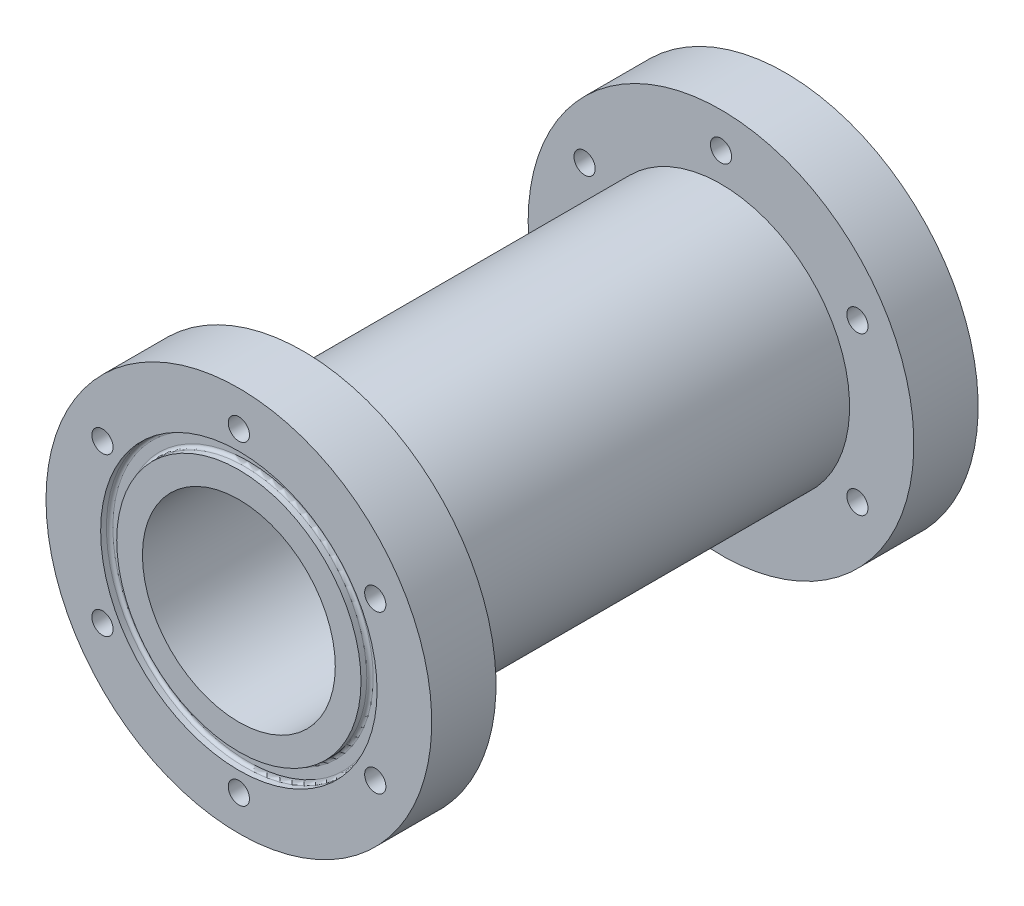
ISO-10303-21;
HEADER;
FILE_DESCRIPTION(('STEP AP214'),'2;1');
FILE_NAME('part.step','',(''),(''),'','','');
FILE_SCHEMA(('AUTOMOTIVE_DESIGN { 1 0 10303 214 1 1 1 1 }'));
ENDSEC;
DATA;
#1=APPLICATION_CONTEXT('core data for automotive mechanical design processes');
#2=APPLICATION_PROTOCOL_DEFINITION('international standard','automotive_design',2000,#1);
#3=PRODUCT_CONTEXT('',#1,'mechanical');
#4=PRODUCT('Part','Part','',(#3));
#5=PRODUCT_RELATED_PRODUCT_CATEGORY('part','',(#4));
#6=PRODUCT_DEFINITION_FORMATION('','',#4);
#7=PRODUCT_DEFINITION_CONTEXT('part definition',#1,'design');
#8=PRODUCT_DEFINITION('design','',#6,#7);
#9=PRODUCT_DEFINITION_SHAPE('','',#8);
#10=(LENGTH_UNIT() NAMED_UNIT(*) SI_UNIT(.MILLI.,.METRE.));
#11=(NAMED_UNIT(*) PLANE_ANGLE_UNIT() SI_UNIT($,.RADIAN.));
#12=(NAMED_UNIT(*) SI_UNIT($,.STERADIAN.) SOLID_ANGLE_UNIT());
#13=UNCERTAINTY_MEASURE_WITH_UNIT(LENGTH_MEASURE(1.E-05),#10,'distance_accuracy_value','');
#14=(GEOMETRIC_REPRESENTATION_CONTEXT(3) GLOBAL_UNCERTAINTY_ASSIGNED_CONTEXT((#13)) GLOBAL_UNIT_ASSIGNED_CONTEXT((#10,
#11,#12)) REPRESENTATION_CONTEXT('',''));
#15=CARTESIAN_POINT('',(0.,0.,0.));
#16=DIRECTION('',(0.,0.,1.));
#17=DIRECTION('',(1.,0.,0.));
#18=AXIS2_PLACEMENT_3D('',#15,#16,#17);
#19=CARTESIAN_POINT('',(0.,0.,42.5));
#20=DIRECTION('',(0.,0.,1.));
#21=DIRECTION('',(1.,0.,0.));
#22=AXIS2_PLACEMENT_3D('',#19,#20,#21);
#23=PLANE('',#22);
#24=CARTESIAN_POINT('',(0.,0.,42.5));
#25=DIRECTION('',(0.,0.,1.));
#26=DIRECTION('',(1.,0.,0.));
#27=AXIS2_PLACEMENT_3D('',#24,#25,#26);
#28=CIRCLE('',#27,15.);
#29=CARTESIAN_POINT('',(15.,0.,42.5));
#30=VERTEX_POINT('',#29);
#31=EDGE_CURVE('E79',#30,#30,#28,.T.);
#32=ORIENTED_EDGE('',*,*,#31,.F.);
#33=EDGE_LOOP('',(#32));
#34=FACE_BOUND('',#33,.T.);
#35=CARTESIAN_POINT('',(0.,0.,42.5));
#36=DIRECTION('',(0.,0.,-1.));
#37=DIRECTION('',(-1.,0.,0.));
#38=AXIS2_PLACEMENT_3D('',#35,#36,#37);
#39=CIRCLE('',#38,19.);
#40=CARTESIAN_POINT('',(-19.,0.,42.5));
#41=VERTEX_POINT('',#40);
#42=EDGE_CURVE('E178',#41,#41,#39,.T.);
#43=ORIENTED_EDGE('',*,*,#42,.F.);
#44=EDGE_LOOP('',(#43));
#45=FACE_BOUND('',#44,.T.);
#46=ADVANCED_FACE('F41',(#34,#45),#23,.T.);
#47=CARTESIAN_POINT('',(0.,0.,42.5));
#48=DIRECTION('',(0.,0.,-1.));
#49=DIRECTION('',(-1.,0.,0.));
#50=AXIS2_PLACEMENT_3D('',#47,#48,#49);
#51=CYLINDRICAL_SURFACE('',#50,20.);
#52=CARTESIAN_POINT('',(0.,0.,-32.5));
#53=DIRECTION('',(0.,0.,-1.));
#54=DIRECTION('',(-1.,0.,0.));
#55=AXIS2_PLACEMENT_3D('',#52,#53,#54);
#56=CIRCLE('',#55,20.);
#57=CARTESIAN_POINT('',(-20.,0.,-32.5));
#58=VERTEX_POINT('',#57);
#59=EDGE_CURVE('E76',#58,#58,#56,.T.);
#60=ORIENTED_EDGE('',*,*,#59,.F.);
#61=EDGE_LOOP('',(#60));
#62=FACE_BOUND('',#61,.T.);
#63=CARTESIAN_POINT('',(0.,0.,32.5));
#64=DIRECTION('',(0.,0.,1.));
#65=DIRECTION('',(1.,0.,0.));
#66=AXIS2_PLACEMENT_3D('',#63,#64,#65);
#67=CIRCLE('',#66,20.);
#68=CARTESIAN_POINT('',(20.,0.,32.5));
#69=VERTEX_POINT('',#68);
#70=EDGE_CURVE('E61',#69,#69,#67,.T.);
#71=ORIENTED_EDGE('',*,*,#70,.F.);
#72=EDGE_LOOP('',(#71));
#73=FACE_BOUND('',#72,.T.);
#74=ADVANCED_FACE('F185',(#62,#73),#51,.T.);
#75=CARTESIAN_POINT('',(0.,0.,-42.5));
#76=DIRECTION('',(0.,0.,1.));
#77=DIRECTION('',(1.,0.,0.));
#78=AXIS2_PLACEMENT_3D('',#75,#76,#77);
#79=PLANE('',#78);
#80=CARTESIAN_POINT('',(0.,0.,-42.5));
#81=DIRECTION('',(0.,0.,1.));
#82=DIRECTION('',(1.,0.,0.));
#83=AXIS2_PLACEMENT_3D('',#80,#81,#82);
#84=CIRCLE('',#83,15.);
#85=CARTESIAN_POINT('',(15.,0.,-42.5));
#86=VERTEX_POINT('',#85);
#87=EDGE_CURVE('E80',#86,#86,#84,.T.);
#88=ORIENTED_EDGE('',*,*,#87,.T.);
#89=EDGE_LOOP('',(#88));
#90=FACE_BOUND('',#89,.T.);
#91=CARTESIAN_POINT('',(0.,0.,-42.5));
#92=DIRECTION('',(0.,0.,-1.));
#93=DIRECTION('',(-1.,0.,0.));
#94=AXIS2_PLACEMENT_3D('',#91,#92,#93);
#95=CIRCLE('',#94,19.);
#96=CARTESIAN_POINT('',(-19.,0.,-42.5));
#97=VERTEX_POINT('',#96);
#98=EDGE_CURVE('E130',#97,#97,#95,.T.);
#99=ORIENTED_EDGE('',*,*,#98,.T.);
#100=EDGE_LOOP('',(#99));
#101=FACE_BOUND('',#100,.T.);
#102=ADVANCED_FACE('F192',(#90,#101),#79,.F.);
#103=CARTESIAN_POINT('',(0.,0.,-42.5));
#104=DIRECTION('',(0.,0.,-1.));
#105=DIRECTION('',(-1.,0.,0.));
#106=AXIS2_PLACEMENT_3D('',#103,#104,#105);
#107=CIRCLE('',#106,21.5);
#108=CARTESIAN_POINT('',(-21.5,0.,-42.5));
#109=VERTEX_POINT('',#108);
#110=EDGE_CURVE('E127',#109,#109,#107,.T.);
#111=ORIENTED_EDGE('',*,*,#110,.F.);
#112=EDGE_LOOP('',(#111));
#113=FACE_BOUND('',#112,.T.);
#114=CARTESIAN_POINT('',(-21.2176223927189,-12.2499999999998,-42.5));
#115=DIRECTION('',(0.,0.,-1.));
#116=DIRECTION('',(-1.,0.,0.));
#117=AXIS2_PLACEMENT_3D('',#114,#115,#116);
#118=CIRCLE('',#117,1.65);
#119=CARTESIAN_POINT('',(-22.8676223927189,-12.2499999999998,-42.5));
#120=VERTEX_POINT('',#119);
#121=EDGE_CURVE('E118',#120,#120,#118,.T.);
#122=ORIENTED_EDGE('',*,*,#121,.F.);
#123=EDGE_LOOP('',(#122));
#124=FACE_BOUND('',#123,.T.);
#125=CARTESIAN_POINT('',(0.,-24.5,-42.5));
#126=DIRECTION('',(0.,0.,-1.));
#127=DIRECTION('',(-1.,0.,0.));
#128=AXIS2_PLACEMENT_3D('',#125,#126,#127);
#129=CIRCLE('',#128,1.65);
#130=CARTESIAN_POINT('',(-1.65,-24.5,-42.5));
#131=VERTEX_POINT('',#130);
#132=EDGE_CURVE('E112',#131,#131,#129,.T.);
#133=ORIENTED_EDGE('',*,*,#132,.F.);
#134=EDGE_LOOP('',(#133));
#135=FACE_BOUND('',#134,.T.);
#136=CARTESIAN_POINT('',(21.2176223927187,-12.2500000000001,-42.5));
#137=DIRECTION('',(0.,0.,-1.));
#138=DIRECTION('',(-1.,0.,0.));
#139=AXIS2_PLACEMENT_3D('',#136,#137,#138);
#140=CIRCLE('',#139,1.65);
#141=CARTESIAN_POINT('',(19.5676223927187,-12.2500000000001,-42.5));
#142=VERTEX_POINT('',#141);
#143=EDGE_CURVE('E106',#142,#142,#140,.T.);
#144=ORIENTED_EDGE('',*,*,#143,.F.);
#145=EDGE_LOOP('',(#144));
#146=FACE_BOUND('',#145,.T.);
#147=CARTESIAN_POINT('',(21.2176223927188,12.25,-42.5));
#148=DIRECTION('',(0.,0.,-1.));
#149=DIRECTION('',(-1.,0.,0.));
#150=AXIS2_PLACEMENT_3D('',#147,#148,#149);
#151=CIRCLE('',#150,1.65);
#152=CARTESIAN_POINT('',(19.5676223927188,12.25,-42.5));
#153=VERTEX_POINT('',#152);
#154=EDGE_CURVE('E100',#153,#153,#151,.T.);
#155=ORIENTED_EDGE('',*,*,#154,.F.);
#156=EDGE_LOOP('',(#155));
#157=FACE_BOUND('',#156,.T.);
#158=CARTESIAN_POINT('',(0.,24.5,-42.5));
#159=DIRECTION('',(0.,0.,-1.));
#160=DIRECTION('',(-1.,0.,0.));
#161=AXIS2_PLACEMENT_3D('',#158,#159,#160);
#162=CIRCLE('',#161,1.65);
#163=CARTESIAN_POINT('',(-1.65,24.5,-42.5));
#164=VERTEX_POINT('',#163);
#165=EDGE_CURVE('E94',#164,#164,#162,.T.);
#166=ORIENTED_EDGE('',*,*,#165,.F.);
#167=EDGE_LOOP('',(#166));
#168=FACE_BOUND('',#167,.T.);
#169=CARTESIAN_POINT('',(0.,0.,-42.5));
#170=DIRECTION('',(0.,0.,-1.));
#171=DIRECTION('',(-1.,0.,0.));
#172=AXIS2_PLACEMENT_3D('',#169,#170,#171);
#173=CIRCLE('',#172,30.);
#174=CARTESIAN_POINT('',(-30.,0.,-42.5));
#175=VERTEX_POINT('',#174);
#176=EDGE_CURVE('E86',#175,#175,#173,.T.);
#177=ORIENTED_EDGE('',*,*,#176,.T.);
#178=EDGE_LOOP('',(#177));
#179=FACE_BOUND('',#178,.T.);
#180=CARTESIAN_POINT('',(-21.2176223927186,12.2500000000002,-42.5));
#181=DIRECTION('',(0.,0.,-1.));
#182=DIRECTION('',(-1.,0.,0.));
#183=AXIS2_PLACEMENT_3D('',#180,#181,#182);
#184=CIRCLE('',#183,1.65);
#185=CARTESIAN_POINT('',(-22.8676223927186,12.2500000000002,-42.5));
#186=VERTEX_POINT('',#185);
#187=EDGE_CURVE('E124',#186,#186,#184,.T.);
#188=ORIENTED_EDGE('',*,*,#187,.F.);
#189=EDGE_LOOP('',(#188));
#190=FACE_BOUND('',#189,.T.);
#191=ADVANCED_FACE('F200',(#113,#124,#135,#146,#157,#168,#179,#190),#79,.F.);
#192=CARTESIAN_POINT('',(0.,0.,42.5));
#193=DIRECTION('',(0.,0.,-1.));
#194=DIRECTION('',(-1.,0.,0.));
#195=AXIS2_PLACEMENT_3D('',#192,#193,#194);
#196=CIRCLE('',#195,21.5);
#197=CARTESIAN_POINT('',(-21.5,0.,42.5));
#198=VERTEX_POINT('',#197);
#199=EDGE_CURVE('E175',#198,#198,#196,.T.);
#200=ORIENTED_EDGE('',*,*,#199,.T.);
#201=EDGE_LOOP('',(#200));
#202=FACE_BOUND('',#201,.T.);
#203=CARTESIAN_POINT('',(-21.2176223927186,12.2500000000002,42.5));
#204=DIRECTION('',(0.,0.,1.));
#205=DIRECTION('',(1.,0.,0.));
#206=AXIS2_PLACEMENT_3D('',#203,#204,#205);
#207=CIRCLE('',#206,1.65);
#208=CARTESIAN_POINT('',(-19.5676223927186,12.2500000000002,42.5));
#209=VERTEX_POINT('',#208);
#210=EDGE_CURVE('E172',#209,#209,#207,.T.);
#211=ORIENTED_EDGE('',*,*,#210,.F.);
#212=EDGE_LOOP('',(#211));
#213=FACE_BOUND('',#212,.T.);
#214=CARTESIAN_POINT('',(-21.2176223927189,-12.2499999999998,42.5));
#215=DIRECTION('',(0.,0.,1.));
#216=DIRECTION('',(1.,0.,0.));
#217=AXIS2_PLACEMENT_3D('',#214,#215,#216);
#218=CIRCLE('',#217,1.65);
#219=CARTESIAN_POINT('',(-19.5676223927189,-12.2499999999998,42.5));
#220=VERTEX_POINT('',#219);
#221=EDGE_CURVE('E166',#220,#220,#218,.T.);
#222=ORIENTED_EDGE('',*,*,#221,.F.);
#223=EDGE_LOOP('',(#222));
#224=FACE_BOUND('',#223,.T.);
#225=CARTESIAN_POINT('',(0.,-24.5,42.5));
#226=DIRECTION('',(0.,0.,1.));
#227=DIRECTION('',(1.,0.,0.));
#228=AXIS2_PLACEMENT_3D('',#225,#226,#227);
#229=CIRCLE('',#228,1.65);
#230=CARTESIAN_POINT('',(1.65,-24.5,42.5));
#231=VERTEX_POINT('',#230);
#232=EDGE_CURVE('E160',#231,#231,#229,.T.);
#233=ORIENTED_EDGE('',*,*,#232,.F.);
#234=EDGE_LOOP('',(#233));
#235=FACE_BOUND('',#234,.T.);
#236=CARTESIAN_POINT('',(21.2176223927187,-12.2500000000001,42.5));
#237=DIRECTION('',(0.,0.,1.));
#238=DIRECTION('',(1.,0.,0.));
#239=AXIS2_PLACEMENT_3D('',#236,#237,#238);
#240=CIRCLE('',#239,1.65);
#241=CARTESIAN_POINT('',(22.8676223927187,-12.2500000000001,42.5));
#242=VERTEX_POINT('',#241);
#243=EDGE_CURVE('E154',#242,#242,#240,.T.);
#244=ORIENTED_EDGE('',*,*,#243,.F.);
#245=EDGE_LOOP('',(#244));
#246=FACE_BOUND('',#245,.T.);
#247=CARTESIAN_POINT('',(21.2176223927188,12.25,42.5));
#248=DIRECTION('',(0.,0.,1.));
#249=DIRECTION('',(1.,0.,0.));
#250=AXIS2_PLACEMENT_3D('',#247,#248,#249);
#251=CIRCLE('',#250,1.65);
#252=CARTESIAN_POINT('',(22.8676223927188,12.25,42.5));
#253=VERTEX_POINT('',#252);
#254=EDGE_CURVE('E148',#253,#253,#251,.T.);
#255=ORIENTED_EDGE('',*,*,#254,.F.);
#256=EDGE_LOOP('',(#255));
#257=FACE_BOUND('',#256,.T.);
#258=CARTESIAN_POINT('',(0.,24.5,42.5));
#259=DIRECTION('',(0.,0.,1.));
#260=DIRECTION('',(1.,0.,0.));
#261=AXIS2_PLACEMENT_3D('',#258,#259,#260);
#262=CIRCLE('',#261,1.65);
#263=CARTESIAN_POINT('',(1.65,24.5,42.5));
#264=VERTEX_POINT('',#263);
#265=EDGE_CURVE('E142',#264,#264,#262,.T.);
#266=ORIENTED_EDGE('',*,*,#265,.F.);
#267=EDGE_LOOP('',(#266));
#268=FACE_BOUND('',#267,.T.);
#269=CARTESIAN_POINT('',(0.,0.,42.5));
#270=DIRECTION('',(0.,0.,-1.));
#271=DIRECTION('',(-1.,0.,0.));
#272=AXIS2_PLACEMENT_3D('',#269,#270,#271);
#273=CIRCLE('',#272,30.);
#274=CARTESIAN_POINT('',(-30.,0.,42.5));
#275=VERTEX_POINT('',#274);
#276=EDGE_CURVE('E134',#275,#275,#273,.T.);
#277=ORIENTED_EDGE('',*,*,#276,.F.);
#278=EDGE_LOOP('',(#277));
#279=FACE_BOUND('',#278,.T.);
#280=ADVANCED_FACE('F188',(#202,#213,#224,#235,#246,#257,#268,#279),#23,.T.);
#281=CARTESIAN_POINT('',(0.,0.,42.5));
#282=DIRECTION('',(0.,0.,-1.));
#283=DIRECTION('',(-1.,0.,0.));
#284=AXIS2_PLACEMENT_3D('',#281,#282,#283);
#285=CYLINDRICAL_SURFACE('',#284,15.);
#286=ORIENTED_EDGE('',*,*,#31,.T.);
#287=EDGE_LOOP('',(#286));
#288=FACE_BOUND('',#287,.T.);
#289=ORIENTED_EDGE('',*,*,#87,.F.);
#290=EDGE_LOOP('',(#289));
#291=FACE_BOUND('',#290,.T.);
#292=ADVANCED_FACE('F199',(#288,#291),#285,.F.);
#293=CARTESIAN_POINT('',(0.,0.,-32.5));
#294=DIRECTION('',(0.,0.,-1.));
#295=DIRECTION('',(-1.,0.,0.));
#296=AXIS2_PLACEMENT_3D('',#293,#294,#295);
#297=CYLINDRICAL_SURFACE('',#296,30.);
#298=CARTESIAN_POINT('',(0.,0.,-32.5));
#299=DIRECTION('',(0.,0.,-1.));
#300=DIRECTION('',(-1.,0.,0.));
#301=AXIS2_PLACEMENT_3D('',#298,#299,#300);
#302=CIRCLE('',#301,30.);
#303=CARTESIAN_POINT('',(-30.,0.,-32.5));
#304=VERTEX_POINT('',#303);
#305=EDGE_CURVE('E83',#304,#304,#302,.T.);
#306=ORIENTED_EDGE('',*,*,#305,.T.);
#307=EDGE_LOOP('',(#306));
#308=FACE_BOUND('',#307,.T.);
#309=ORIENTED_EDGE('',*,*,#176,.F.);
#310=EDGE_LOOP('',(#309));
#311=FACE_BOUND('',#310,.T.);
#312=ADVANCED_FACE('F206',(#308,#311),#297,.T.);
#313=CARTESIAN_POINT('',(0.,0.,-32.5));
#314=DIRECTION('',(0.,0.,-1.));
#315=DIRECTION('',(-1.,0.,0.));
#316=AXIS2_PLACEMENT_3D('',#313,#314,#315);
#317=PLANE('',#316);
#318=CARTESIAN_POINT('',(-21.2176223927186,12.2500000000002,-32.5));
#319=DIRECTION('',(0.,0.,-1.));
#320=DIRECTION('',(-1.,0.,0.));
#321=AXIS2_PLACEMENT_3D('',#318,#319,#320);
#322=CIRCLE('',#321,1.65);
#323=CARTESIAN_POINT('',(-22.8676223927186,12.2500000000002,-32.5));
#324=VERTEX_POINT('',#323);
#325=EDGE_CURVE('E121',#324,#324,#322,.T.);
#326=ORIENTED_EDGE('',*,*,#325,.T.);
#327=EDGE_LOOP('',(#326));
#328=FACE_BOUND('',#327,.T.);
#329=CARTESIAN_POINT('',(-21.2176223927189,-12.2499999999998,-32.5));
#330=DIRECTION('',(0.,0.,-1.));
#331=DIRECTION('',(-1.,0.,0.));
#332=AXIS2_PLACEMENT_3D('',#329,#330,#331);
#333=CIRCLE('',#332,1.65);
#334=CARTESIAN_POINT('',(-22.8676223927189,-12.2499999999998,-32.5));
#335=VERTEX_POINT('',#334);
#336=EDGE_CURVE('E115',#335,#335,#333,.T.);
#337=ORIENTED_EDGE('',*,*,#336,.T.);
#338=EDGE_LOOP('',(#337));
#339=FACE_BOUND('',#338,.T.);
#340=CARTESIAN_POINT('',(0.,-24.5,-32.5));
#341=DIRECTION('',(0.,0.,-1.));
#342=DIRECTION('',(-1.,0.,0.));
#343=AXIS2_PLACEMENT_3D('',#340,#341,#342);
#344=CIRCLE('',#343,1.65);
#345=CARTESIAN_POINT('',(-1.65,-24.5,-32.5));
#346=VERTEX_POINT('',#345);
#347=EDGE_CURVE('E109',#346,#346,#344,.T.);
#348=ORIENTED_EDGE('',*,*,#347,.T.);
#349=EDGE_LOOP('',(#348));
#350=FACE_BOUND('',#349,.T.);
#351=CARTESIAN_POINT('',(21.2176223927187,-12.2500000000001,-32.5));
#352=DIRECTION('',(0.,0.,-1.));
#353=DIRECTION('',(-1.,0.,0.));
#354=AXIS2_PLACEMENT_3D('',#351,#352,#353);
#355=CIRCLE('',#354,1.65);
#356=CARTESIAN_POINT('',(19.5676223927187,-12.2500000000001,-32.5));
#357=VERTEX_POINT('',#356);
#358=EDGE_CURVE('E103',#357,#357,#355,.T.);
#359=ORIENTED_EDGE('',*,*,#358,.T.);
#360=EDGE_LOOP('',(#359));
#361=FACE_BOUND('',#360,.T.);
#362=CARTESIAN_POINT('',(21.2176223927188,12.25,-32.5));
#363=DIRECTION('',(0.,0.,-1.));
#364=DIRECTION('',(-1.,0.,0.));
#365=AXIS2_PLACEMENT_3D('',#362,#363,#364);
#366=CIRCLE('',#365,1.65);
#367=CARTESIAN_POINT('',(19.5676223927188,12.25,-32.5));
#368=VERTEX_POINT('',#367);
#369=EDGE_CURVE('E97',#368,#368,#366,.T.);
#370=ORIENTED_EDGE('',*,*,#369,.T.);
#371=EDGE_LOOP('',(#370));
#372=FACE_BOUND('',#371,.T.);
#373=CARTESIAN_POINT('',(0.,24.5,-32.5));
#374=DIRECTION('',(0.,0.,-1.));
#375=DIRECTION('',(-1.,0.,0.));
#376=AXIS2_PLACEMENT_3D('',#373,#374,#375);
#377=CIRCLE('',#376,1.65);
#378=CARTESIAN_POINT('',(-1.65,24.5,-32.5));
#379=VERTEX_POINT('',#378);
#380=EDGE_CURVE('E89',#379,#379,#377,.T.);
#381=ORIENTED_EDGE('',*,*,#380,.T.);
#382=EDGE_LOOP('',(#381));
#383=FACE_BOUND('',#382,.T.);
#384=ORIENTED_EDGE('',*,*,#59,.T.);
#385=EDGE_LOOP('',(#384));
#386=FACE_BOUND('',#385,.T.);
#387=ORIENTED_EDGE('',*,*,#305,.F.);
#388=EDGE_LOOP('',(#387));
#389=FACE_BOUND('',#388,.T.);
#390=ADVANCED_FACE('F279',(#328,#339,#350,#361,#372,#383,#386,#389),#317,.F.);
#391=CARTESIAN_POINT('',(0.,24.5,-42.5));
#392=DIRECTION('',(0.,0.,-1.));
#393=DIRECTION('',(-1.,0.,0.));
#394=AXIS2_PLACEMENT_3D('',#391,#392,#393);
#395=CYLINDRICAL_SURFACE('',#394,1.65);
#396=ORIENTED_EDGE('',*,*,#380,.F.);
#397=EDGE_LOOP('',(#396));
#398=FACE_BOUND('',#397,.T.);
#399=ORIENTED_EDGE('',*,*,#165,.T.);
#400=EDGE_LOOP('',(#399));
#401=FACE_BOUND('',#400,.T.);
#402=ADVANCED_FACE('F275',(#398,#401),#395,.F.);
#403=CARTESIAN_POINT('',(21.2176223927188,12.25,-42.5));
#404=DIRECTION('',(0.,0.,-1.));
#405=DIRECTION('',(-1.,0.,0.));
#406=AXIS2_PLACEMENT_3D('',#403,#404,#405);
#407=CYLINDRICAL_SURFACE('',#406,1.65);
#408=ORIENTED_EDGE('',*,*,#369,.F.);
#409=EDGE_LOOP('',(#408));
#410=FACE_BOUND('',#409,.T.);
#411=ORIENTED_EDGE('',*,*,#154,.T.);
#412=EDGE_LOOP('',(#411));
#413=FACE_BOUND('',#412,.T.);
#414=ADVANCED_FACE('F271',(#410,#413),#407,.F.);
#415=CARTESIAN_POINT('',(21.2176223927187,-12.2500000000001,-42.5));
#416=DIRECTION('',(0.,0.,-1.));
#417=DIRECTION('',(-1.,0.,0.));
#418=AXIS2_PLACEMENT_3D('',#415,#416,#417);
#419=CYLINDRICAL_SURFACE('',#418,1.65);
#420=ORIENTED_EDGE('',*,*,#358,.F.);
#421=EDGE_LOOP('',(#420));
#422=FACE_BOUND('',#421,.T.);
#423=ORIENTED_EDGE('',*,*,#143,.T.);
#424=EDGE_LOOP('',(#423));
#425=FACE_BOUND('',#424,.T.);
#426=ADVANCED_FACE('F267',(#422,#425),#419,.F.);
#427=CARTESIAN_POINT('',(0.,-24.5,-42.5));
#428=DIRECTION('',(0.,0.,-1.));
#429=DIRECTION('',(-1.,0.,0.));
#430=AXIS2_PLACEMENT_3D('',#427,#428,#429);
#431=CYLINDRICAL_SURFACE('',#430,1.65);
#432=ORIENTED_EDGE('',*,*,#347,.F.);
#433=EDGE_LOOP('',(#432));
#434=FACE_BOUND('',#433,.T.);
#435=ORIENTED_EDGE('',*,*,#132,.T.);
#436=EDGE_LOOP('',(#435));
#437=FACE_BOUND('',#436,.T.);
#438=ADVANCED_FACE('F263',(#434,#437),#431,.F.);
#439=CARTESIAN_POINT('',(-21.2176223927189,-12.2499999999998,-42.5));
#440=DIRECTION('',(0.,0.,-1.));
#441=DIRECTION('',(-1.,0.,0.));
#442=AXIS2_PLACEMENT_3D('',#439,#440,#441);
#443=CYLINDRICAL_SURFACE('',#442,1.65);
#444=ORIENTED_EDGE('',*,*,#336,.F.);
#445=EDGE_LOOP('',(#444));
#446=FACE_BOUND('',#445,.T.);
#447=ORIENTED_EDGE('',*,*,#121,.T.);
#448=EDGE_LOOP('',(#447));
#449=FACE_BOUND('',#448,.T.);
#450=ADVANCED_FACE('F259',(#446,#449),#443,.F.);
#451=CARTESIAN_POINT('',(-21.2176223927186,12.2500000000002,-42.5));
#452=DIRECTION('',(0.,0.,-1.));
#453=DIRECTION('',(-1.,0.,0.));
#454=AXIS2_PLACEMENT_3D('',#451,#452,#453);
#455=CYLINDRICAL_SURFACE('',#454,1.65);
#456=ORIENTED_EDGE('',*,*,#325,.F.);
#457=EDGE_LOOP('',(#456));
#458=FACE_BOUND('',#457,.T.);
#459=ORIENTED_EDGE('',*,*,#187,.T.);
#460=EDGE_LOOP('',(#459));
#461=FACE_BOUND('',#460,.T.);
#462=ADVANCED_FACE('F255',(#458,#461),#455,.F.);
#463=CARTESIAN_POINT('',(0.,0.,-41.1));
#464=DIRECTION('',(0.,0.,-1.));
#465=DIRECTION('',(-1.,0.,0.));
#466=AXIS2_PLACEMENT_3D('',#463,#464,#465);
#467=CYLINDRICAL_SURFACE('',#466,21.5);
#468=CARTESIAN_POINT('',(0.,0.,-41.6));
#469=DIRECTION('',(0.,0.,-1.));
#470=DIRECTION('',(-1.,0.,0.));
#471=AXIS2_PLACEMENT_3D('',#468,#469,#470);
#472=CIRCLE('',#471,21.5);
#473=CARTESIAN_POINT('',(-21.5,0.,-41.6));
#474=VERTEX_POINT('',#473);
#475=EDGE_CURVE('E64',#474,#474,#472,.F.);
#476=ORIENTED_EDGE('',*,*,#475,.T.);
#477=EDGE_LOOP('',(#476));
#478=FACE_BOUND('',#477,.T.);
#479=ORIENTED_EDGE('',*,*,#110,.T.);
#480=EDGE_LOOP('',(#479));
#481=FACE_BOUND('',#480,.T.);
#482=ADVANCED_FACE('F251',(#478,#481),#467,.F.);
#483=CARTESIAN_POINT('',(0.,0.,-41.1));
#484=DIRECTION('',(0.,0.,-1.));
#485=DIRECTION('',(-1.,0.,0.));
#486=AXIS2_PLACEMENT_3D('',#483,#484,#485);
#487=PLANE('',#486);
#488=CARTESIAN_POINT('',(0.,0.,-41.1));
#489=DIRECTION('',(0.,0.,-1.));
#490=DIRECTION('',(-1.,0.,0.));
#491=AXIS2_PLACEMENT_3D('',#488,#489,#490);
#492=CIRCLE('',#491,19.5);
#493=CARTESIAN_POINT('',(-19.5,0.,-41.1));
#494=VERTEX_POINT('',#493);
#495=EDGE_CURVE('E67',#494,#494,#492,.F.);
#496=ORIENTED_EDGE('',*,*,#495,.T.);
#497=EDGE_LOOP('',(#496));
#498=FACE_BOUND('',#497,.T.);
#499=CARTESIAN_POINT('',(0.,0.,-41.1));
#500=DIRECTION('',(0.,0.,-1.));
#501=DIRECTION('',(-1.,0.,0.));
#502=AXIS2_PLACEMENT_3D('',#499,#500,#501);
#503=CIRCLE('',#502,21.);
#504=CARTESIAN_POINT('',(-21.,0.,-41.1));
#505=VERTEX_POINT('',#504);
#506=EDGE_CURVE('E70',#505,#505,#503,.T.);
#507=ORIENTED_EDGE('',*,*,#506,.T.);
#508=EDGE_LOOP('',(#507));
#509=FACE_BOUND('',#508,.T.);
#510=ADVANCED_FACE('F247',(#498,#509),#487,.T.);
#511=CARTESIAN_POINT('',(0.,0.,-41.1));
#512=DIRECTION('',(0.,0.,-1.));
#513=DIRECTION('',(-1.,0.,0.));
#514=AXIS2_PLACEMENT_3D('',#511,#512,#513);
#515=CYLINDRICAL_SURFACE('',#514,19.);
#516=CARTESIAN_POINT('',(0.,0.,-41.6));
#517=DIRECTION('',(0.,0.,-1.));
#518=DIRECTION('',(-1.,0.,0.));
#519=AXIS2_PLACEMENT_3D('',#516,#517,#518);
#520=CIRCLE('',#519,19.);
#521=CARTESIAN_POINT('',(-19.,0.,-41.6));
#522=VERTEX_POINT('',#521);
#523=EDGE_CURVE('E73',#522,#522,#520,.T.);
#524=ORIENTED_EDGE('',*,*,#523,.T.);
#525=EDGE_LOOP('',(#524));
#526=FACE_BOUND('',#525,.T.);
#527=ORIENTED_EDGE('',*,*,#98,.F.);
#528=EDGE_LOOP('',(#527));
#529=FACE_BOUND('',#528,.T.);
#530=ADVANCED_FACE('F243',(#526,#529),#515,.T.);
#531=CARTESIAN_POINT('',(0.,0.,-41.6));
#532=DIRECTION('',(0.,0.,-1.));
#533=DIRECTION('',(-1.,0.,0.));
#534=AXIS2_PLACEMENT_3D('',#531,#532,#533);
#535=TOROIDAL_SURFACE('',#534,19.5,0.5);
#536=ORIENTED_EDGE('',*,*,#495,.F.);
#537=EDGE_LOOP('',(#536));
#538=FACE_BOUND('',#537,.T.);
#539=ORIENTED_EDGE('',*,*,#523,.F.);
#540=EDGE_LOOP('',(#539));
#541=FACE_BOUND('',#540,.T.);
#542=ADVANCED_FACE('F246',(#538,#541),#535,.F.);
#543=CARTESIAN_POINT('',(0.,0.,-41.6));
#544=DIRECTION('',(0.,0.,-1.));
#545=DIRECTION('',(-1.,0.,0.));
#546=AXIS2_PLACEMENT_3D('',#543,#544,#545);
#547=TOROIDAL_SURFACE('',#546,21.,0.5);
#548=ORIENTED_EDGE('',*,*,#475,.F.);
#549=EDGE_LOOP('',(#548));
#550=FACE_BOUND('',#549,.T.);
#551=ORIENTED_EDGE('',*,*,#506,.F.);
#552=EDGE_LOOP('',(#551));
#553=FACE_BOUND('',#552,.T.);
#554=ADVANCED_FACE('F238',(#550,#553),#547,.F.);
#555=CARTESIAN_POINT('',(0.,0.,32.5));
#556=DIRECTION('',(0.,0.,1.));
#557=DIRECTION('',(-1.,0.,0.));
#558=AXIS2_PLACEMENT_3D('',#555,#556,#557);
#559=PLANE('',#558);
#560=CARTESIAN_POINT('',(-21.2176223927186,12.2500000000002,32.5));
#561=DIRECTION('',(0.,0.,1.));
#562=DIRECTION('',(1.,0.,0.));
#563=AXIS2_PLACEMENT_3D('',#560,#561,#562);
#564=CIRCLE('',#563,1.65);
#565=CARTESIAN_POINT('',(-19.5676223927186,12.2500000000002,32.5));
#566=VERTEX_POINT('',#565);
#567=EDGE_CURVE('E169',#566,#566,#564,.T.);
#568=ORIENTED_EDGE('',*,*,#567,.T.);
#569=EDGE_LOOP('',(#568));
#570=FACE_BOUND('',#569,.T.);
#571=CARTESIAN_POINT('',(-21.2176223927189,-12.2499999999998,32.5));
#572=DIRECTION('',(0.,0.,1.));
#573=DIRECTION('',(1.,0.,0.));
#574=AXIS2_PLACEMENT_3D('',#571,#572,#573);
#575=CIRCLE('',#574,1.65);
#576=CARTESIAN_POINT('',(-19.5676223927189,-12.2499999999998,32.5));
#577=VERTEX_POINT('',#576);
#578=EDGE_CURVE('E163',#577,#577,#575,.T.);
#579=ORIENTED_EDGE('',*,*,#578,.T.);
#580=EDGE_LOOP('',(#579));
#581=FACE_BOUND('',#580,.T.);
#582=CARTESIAN_POINT('',(0.,-24.5,32.5));
#583=DIRECTION('',(0.,0.,1.));
#584=DIRECTION('',(1.,0.,0.));
#585=AXIS2_PLACEMENT_3D('',#582,#583,#584);
#586=CIRCLE('',#585,1.65);
#587=CARTESIAN_POINT('',(1.65,-24.5,32.5));
#588=VERTEX_POINT('',#587);
#589=EDGE_CURVE('E157',#588,#588,#586,.T.);
#590=ORIENTED_EDGE('',*,*,#589,.T.);
#591=EDGE_LOOP('',(#590));
#592=FACE_BOUND('',#591,.T.);
#593=CARTESIAN_POINT('',(21.2176223927187,-12.2500000000001,32.5));
#594=DIRECTION('',(0.,0.,1.));
#595=DIRECTION('',(1.,0.,0.));
#596=AXIS2_PLACEMENT_3D('',#593,#594,#595);
#597=CIRCLE('',#596,1.65);
#598=CARTESIAN_POINT('',(22.8676223927187,-12.2500000000001,32.5));
#599=VERTEX_POINT('',#598);
#600=EDGE_CURVE('E151',#599,#599,#597,.T.);
#601=ORIENTED_EDGE('',*,*,#600,.T.);
#602=EDGE_LOOP('',(#601));
#603=FACE_BOUND('',#602,.T.);
#604=CARTESIAN_POINT('',(21.2176223927188,12.25,32.5));
#605=DIRECTION('',(0.,0.,1.));
#606=DIRECTION('',(1.,0.,0.));
#607=AXIS2_PLACEMENT_3D('',#604,#605,#606);
#608=CIRCLE('',#607,1.65);
#609=CARTESIAN_POINT('',(22.8676223927188,12.25,32.5));
#610=VERTEX_POINT('',#609);
#611=EDGE_CURVE('E145',#610,#610,#608,.T.);
#612=ORIENTED_EDGE('',*,*,#611,.T.);
#613=EDGE_LOOP('',(#612));
#614=FACE_BOUND('',#613,.T.);
#615=CARTESIAN_POINT('',(0.,24.5,32.5));
#616=DIRECTION('',(0.,0.,1.));
#617=DIRECTION('',(1.,0.,0.));
#618=AXIS2_PLACEMENT_3D('',#615,#616,#617);
#619=CIRCLE('',#618,1.65);
#620=CARTESIAN_POINT('',(1.65,24.5,32.5));
#621=VERTEX_POINT('',#620);
#622=EDGE_CURVE('E137',#621,#621,#619,.T.);
#623=ORIENTED_EDGE('',*,*,#622,.T.);
#624=EDGE_LOOP('',(#623));
#625=FACE_BOUND('',#624,.T.);
#626=CARTESIAN_POINT('',(0.,0.,32.5));
#627=DIRECTION('',(0.,0.,-1.));
#628=DIRECTION('',(-1.,0.,0.));
#629=AXIS2_PLACEMENT_3D('',#626,#627,#628);
#630=CIRCLE('',#629,30.);
#631=CARTESIAN_POINT('',(-30.,0.,32.5));
#632=VERTEX_POINT('',#631);
#633=EDGE_CURVE('E133',#632,#632,#630,.T.);
#634=ORIENTED_EDGE('',*,*,#633,.T.);
#635=EDGE_LOOP('',(#634));
#636=FACE_BOUND('',#635,.T.);
#637=ORIENTED_EDGE('',*,*,#70,.T.);
#638=EDGE_LOOP('',(#637));
#639=FACE_BOUND('',#638,.T.);
#640=ADVANCED_FACE('F228',(#570,#581,#592,#603,#614,#625,#636,#639),#559,.F.);
#641=CARTESIAN_POINT('',(0.,0.,32.5));
#642=DIRECTION('',(0.,0.,1.));
#643=DIRECTION('',(1.,0.,0.));
#644=AXIS2_PLACEMENT_3D('',#641,#642,#643);
#645=CYLINDRICAL_SURFACE('',#644,30.);
#646=ORIENTED_EDGE('',*,*,#633,.F.);
#647=EDGE_LOOP('',(#646));
#648=FACE_BOUND('',#647,.T.);
#649=ORIENTED_EDGE('',*,*,#276,.T.);
#650=EDGE_LOOP('',(#649));
#651=FACE_BOUND('',#650,.T.);
#652=ADVANCED_FACE('F225',(#648,#651),#645,.T.);
#653=CARTESIAN_POINT('',(0.,24.5,42.5));
#654=DIRECTION('',(0.,0.,1.));
#655=DIRECTION('',(1.,0.,0.));
#656=AXIS2_PLACEMENT_3D('',#653,#654,#655);
#657=CYLINDRICAL_SURFACE('',#656,1.65);
#658=ORIENTED_EDGE('',*,*,#622,.F.);
#659=EDGE_LOOP('',(#658));
#660=FACE_BOUND('',#659,.T.);
#661=ORIENTED_EDGE('',*,*,#265,.T.);
#662=EDGE_LOOP('',(#661));
#663=FACE_BOUND('',#662,.T.);
#664=ADVANCED_FACE('F227',(#660,#663),#657,.F.);
#665=CARTESIAN_POINT('',(21.2176223927188,12.25,42.5));
#666=DIRECTION('',(0.,0.,1.));
#667=DIRECTION('',(1.,0.,0.));
#668=AXIS2_PLACEMENT_3D('',#665,#666,#667);
#669=CYLINDRICAL_SURFACE('',#668,1.65);
#670=ORIENTED_EDGE('',*,*,#611,.F.);
#671=EDGE_LOOP('',(#670));
#672=FACE_BOUND('',#671,.T.);
#673=ORIENTED_EDGE('',*,*,#254,.T.);
#674=EDGE_LOOP('',(#673));
#675=FACE_BOUND('',#674,.T.);
#676=ADVANCED_FACE('F235',(#672,#675),#669,.F.);
#677=CARTESIAN_POINT('',(21.2176223927187,-12.2500000000001,42.5));
#678=DIRECTION('',(0.,0.,1.));
#679=DIRECTION('',(1.,0.,0.));
#680=AXIS2_PLACEMENT_3D('',#677,#678,#679);
#681=CYLINDRICAL_SURFACE('',#680,1.65);
#682=ORIENTED_EDGE('',*,*,#600,.F.);
#683=EDGE_LOOP('',(#682));
#684=FACE_BOUND('',#683,.T.);
#685=ORIENTED_EDGE('',*,*,#243,.T.);
#686=EDGE_LOOP('',(#685));
#687=FACE_BOUND('',#686,.T.);
#688=ADVANCED_FACE('F392',(#684,#687),#681,.F.);
#689=CARTESIAN_POINT('',(0.,-24.5,42.5));
#690=DIRECTION('',(0.,0.,1.));
#691=DIRECTION('',(1.,0.,0.));
#692=AXIS2_PLACEMENT_3D('',#689,#690,#691);
#693=CYLINDRICAL_SURFACE('',#692,1.65);
#694=ORIENTED_EDGE('',*,*,#589,.F.);
#695=EDGE_LOOP('',(#694));
#696=FACE_BOUND('',#695,.T.);
#697=ORIENTED_EDGE('',*,*,#232,.T.);
#698=EDGE_LOOP('',(#697));
#699=FACE_BOUND('',#698,.T.);
#700=ADVANCED_FACE('F406',(#696,#699),#693,.F.);
#701=CARTESIAN_POINT('',(-21.2176223927189,-12.2499999999998,42.5));
#702=DIRECTION('',(0.,0.,1.));
#703=DIRECTION('',(1.,0.,0.));
#704=AXIS2_PLACEMENT_3D('',#701,#702,#703);
#705=CYLINDRICAL_SURFACE('',#704,1.65);
#706=ORIENTED_EDGE('',*,*,#578,.F.);
#707=EDGE_LOOP('',(#706));
#708=FACE_BOUND('',#707,.T.);
#709=ORIENTED_EDGE('',*,*,#221,.T.);
#710=EDGE_LOOP('',(#709));
#711=FACE_BOUND('',#710,.T.);
#712=ADVANCED_FACE('F419',(#708,#711),#705,.F.);
#713=CARTESIAN_POINT('',(-21.2176223927186,12.2500000000002,42.5));
#714=DIRECTION('',(0.,0.,1.));
#715=DIRECTION('',(1.,0.,0.));
#716=AXIS2_PLACEMENT_3D('',#713,#714,#715);
#717=CYLINDRICAL_SURFACE('',#716,1.65);
#718=ORIENTED_EDGE('',*,*,#567,.F.);
#719=EDGE_LOOP('',(#718));
#720=FACE_BOUND('',#719,.T.);
#721=ORIENTED_EDGE('',*,*,#210,.T.);
#722=EDGE_LOOP('',(#721));
#723=FACE_BOUND('',#722,.T.);
#724=ADVANCED_FACE('F431',(#720,#723),#717,.F.);
#725=CARTESIAN_POINT('',(0.,0.,41.1));
#726=DIRECTION('',(0.,0.,1.));
#727=DIRECTION('',(-1.,0.,0.));
#728=AXIS2_PLACEMENT_3D('',#725,#726,#727);
#729=PLANE('',#728);
#730=CARTESIAN_POINT('',(0.,0.,41.1));
#731=DIRECTION('',(0.,0.,1.));
#732=DIRECTION('',(1.,0.,0.));
#733=AXIS2_PLACEMENT_3D('',#730,#731,#732);
#734=CIRCLE('',#733,19.5);
#735=CARTESIAN_POINT('',(19.5,0.,41.1));
#736=VERTEX_POINT('',#735);
#737=EDGE_CURVE('E52',#736,#736,#734,.F.);
#738=ORIENTED_EDGE('',*,*,#737,.T.);
#739=EDGE_LOOP('',(#738));
#740=FACE_BOUND('',#739,.T.);
#741=CARTESIAN_POINT('',(0.,0.,41.1));
#742=DIRECTION('',(0.,0.,1.));
#743=DIRECTION('',(1.,0.,0.));
#744=AXIS2_PLACEMENT_3D('',#741,#742,#743);
#745=CIRCLE('',#744,21.);
#746=CARTESIAN_POINT('',(21.,0.,41.1));
#747=VERTEX_POINT('',#746);
#748=EDGE_CURVE('E56',#747,#747,#745,.T.);
#749=ORIENTED_EDGE('',*,*,#748,.T.);
#750=EDGE_LOOP('',(#749));
#751=FACE_BOUND('',#750,.T.);
#752=ADVANCED_FACE('F443',(#740,#751),#729,.T.);
#753=CARTESIAN_POINT('',(0.,0.,41.1));
#754=DIRECTION('',(0.,0.,1.));
#755=DIRECTION('',(1.,0.,0.));
#756=AXIS2_PLACEMENT_3D('',#753,#754,#755);
#757=CYLINDRICAL_SURFACE('',#756,21.5);
#758=CARTESIAN_POINT('',(0.,0.,41.6));
#759=DIRECTION('',(0.,0.,1.));
#760=DIRECTION('',(1.,0.,0.));
#761=AXIS2_PLACEMENT_3D('',#758,#759,#760);
#762=CIRCLE('',#761,21.5);
#763=CARTESIAN_POINT('',(21.5,0.,41.6));
#764=VERTEX_POINT('',#763);
#765=EDGE_CURVE('E10',#764,#764,#762,.F.);
#766=ORIENTED_EDGE('',*,*,#765,.T.);
#767=EDGE_LOOP('',(#766));
#768=FACE_BOUND('',#767,.T.);
#769=ORIENTED_EDGE('',*,*,#199,.F.);
#770=EDGE_LOOP('',(#769));
#771=FACE_BOUND('',#770,.T.);
#772=ADVANCED_FACE('F456',(#768,#771),#757,.F.);
#773=CARTESIAN_POINT('',(0.,0.,41.1));
#774=DIRECTION('',(0.,0.,1.));
#775=DIRECTION('',(1.,0.,0.));
#776=AXIS2_PLACEMENT_3D('',#773,#774,#775);
#777=CYLINDRICAL_SURFACE('',#776,19.);
#778=CARTESIAN_POINT('',(0.,0.,41.6));
#779=DIRECTION('',(0.,0.,1.));
#780=DIRECTION('',(1.,0.,0.));
#781=AXIS2_PLACEMENT_3D('',#778,#779,#780);
#782=CIRCLE('',#781,19.);
#783=CARTESIAN_POINT('',(19.,0.,41.6));
#784=VERTEX_POINT('',#783);
#785=EDGE_CURVE('E48',#784,#784,#782,.T.);
#786=ORIENTED_EDGE('',*,*,#785,.T.);
#787=EDGE_LOOP('',(#786));
#788=FACE_BOUND('',#787,.T.);
#789=ORIENTED_EDGE('',*,*,#42,.T.);
#790=EDGE_LOOP('',(#789));
#791=FACE_BOUND('',#790,.T.);
#792=ADVANCED_FACE('F182',(#788,#791),#777,.T.);
#793=CARTESIAN_POINT('',(0.,0.,41.6));
#794=DIRECTION('',(0.,0.,1.));
#795=DIRECTION('',(1.,0.,0.));
#796=AXIS2_PLACEMENT_3D('',#793,#794,#795);
#797=TOROIDAL_SURFACE('',#796,19.5,0.5);
#798=ORIENTED_EDGE('',*,*,#785,.F.);
#799=EDGE_LOOP('',(#798));
#800=FACE_BOUND('',#799,.T.);
#801=ORIENTED_EDGE('',*,*,#737,.F.);
#802=EDGE_LOOP('',(#801));
#803=FACE_BOUND('',#802,.T.);
#804=ADVANCED_FACE('F477',(#800,#803),#797,.F.);
#805=CARTESIAN_POINT('',(0.,0.,41.6));
#806=DIRECTION('',(0.,0.,1.));
#807=DIRECTION('',(1.,0.,0.));
#808=AXIS2_PLACEMENT_3D('',#805,#806,#807);
#809=TOROIDAL_SURFACE('',#808,21.,0.5);
#810=ORIENTED_EDGE('',*,*,#748,.F.);
#811=EDGE_LOOP('',(#810));
#812=FACE_BOUND('',#811,.T.);
#813=ORIENTED_EDGE('',*,*,#765,.F.);
#814=EDGE_LOOP('',(#813));
#815=FACE_BOUND('',#814,.T.);
#816=ADVANCED_FACE('F43',(#812,#815),#809,.F.);
#817=CLOSED_SHELL('',(#46,#74,#102,#191,#280,#292,#312,#390,#402,#414,#426,#438,#450,#462,#482,
#510,#530,#542,#554,#640,#652,#664,#676,#688,#700,#712,#724,#752,#772,#792,#804,#816));
#818=MANIFOLD_SOLID_BREP('B2',#817);
#819=ADVANCED_BREP_SHAPE_REPRESENTATION('',(#18,#818),#14);
#820=SHAPE_DEFINITION_REPRESENTATION(#9,#819);
ENDSEC;
END-ISO-10303-21;
